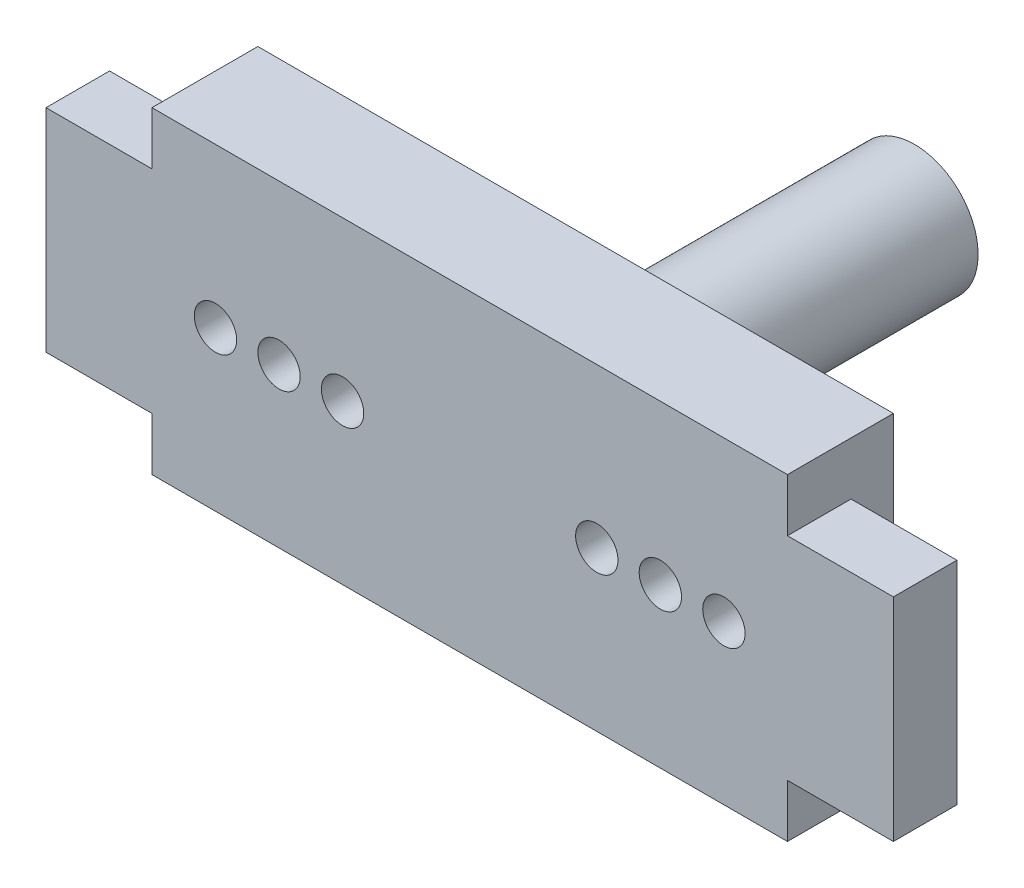
ISO-10303-21;
HEADER;
FILE_DESCRIPTION(('STEP AP214'),'2;1');
FILE_NAME('part.step','',(''),(''),'','','');
FILE_SCHEMA(('AUTOMOTIVE_DESIGN { 1 0 10303 214 1 1 1 1 }'));
ENDSEC;
DATA;
#1=APPLICATION_CONTEXT('core data for automotive mechanical design processes');
#2=APPLICATION_PROTOCOL_DEFINITION('international standard','automotive_design',2000,#1);
#3=PRODUCT_CONTEXT('',#1,'mechanical');
#4=PRODUCT('Part','Part','',(#3));
#5=PRODUCT_RELATED_PRODUCT_CATEGORY('part','',(#4));
#6=PRODUCT_DEFINITION_FORMATION('','',#4);
#7=PRODUCT_DEFINITION_CONTEXT('part definition',#1,'design');
#8=PRODUCT_DEFINITION('design','',#6,#7);
#9=PRODUCT_DEFINITION_SHAPE('','',#8);
#10=(LENGTH_UNIT() NAMED_UNIT(*) SI_UNIT(.MILLI.,.METRE.));
#11=(NAMED_UNIT(*) PLANE_ANGLE_UNIT() SI_UNIT($,.RADIAN.));
#12=(NAMED_UNIT(*) SI_UNIT($,.STERADIAN.) SOLID_ANGLE_UNIT());
#13=UNCERTAINTY_MEASURE_WITH_UNIT(LENGTH_MEASURE(1.E-05),#10,'distance_accuracy_value','');
#14=(GEOMETRIC_REPRESENTATION_CONTEXT(3) GLOBAL_UNCERTAINTY_ASSIGNED_CONTEXT((#13)) GLOBAL_UNIT_ASSIGNED_CONTEXT((#10,
#11,#12)) REPRESENTATION_CONTEXT('',''));
#15=CARTESIAN_POINT('',(0.,0.,0.));
#16=DIRECTION('',(0.,0.,1.));
#17=DIRECTION('',(1.,0.,0.));
#18=AXIS2_PLACEMENT_3D('',#15,#16,#17);
#19=CARTESIAN_POINT('',(-26.8805369127517,15.,0.));
#20=DIRECTION('',(1.,0.,0.));
#21=DIRECTION('',(0.,0.,-1.));
#22=AXIS2_PLACEMENT_3D('',#19,#20,#21);
#23=PLANE('',#22);
#24=DIRECTION('',(0.,0.,1.));
#25=VECTOR('',#24,1.);
#26=CARTESIAN_POINT('',(-26.8805369127517,12.5,-26.7902684563758));
#27=LINE('',#26,#25);
#28=CARTESIAN_POINT('',(-26.8805369127517,12.5,-26.7902684563758));
#29=VERTEX_POINT('',#28);
#30=CARTESIAN_POINT('',(-26.8805369127517,12.5,-23.7902684563758));
#31=VERTEX_POINT('',#30);
#32=EDGE_CURVE('E128',#29,#31,#27,.T.);
#33=ORIENTED_EDGE('',*,*,#32,.F.);
#34=DIRECTION('',(0.,-1.,0.));
#35=VECTOR('',#34,1.);
#36=CARTESIAN_POINT('',(-26.8805369127517,12.5,-26.7902684563758));
#37=LINE('',#36,#35);
#38=CARTESIAN_POINT('',(-26.8805369127517,2.5,-26.7902684563758));
#39=VERTEX_POINT('',#38);
#40=EDGE_CURVE('E154',#29,#39,#37,.T.);
#41=ORIENTED_EDGE('',*,*,#40,.T.);
#42=DIRECTION('',(0.,0.,1.));
#43=VECTOR('',#42,1.);
#44=CARTESIAN_POINT('',(-26.8805369127517,2.5,-26.7902684563758));
#45=LINE('',#44,#43);
#46=CARTESIAN_POINT('',(-26.8805369127517,2.5,-23.7902684563758));
#47=VERTEX_POINT('',#46);
#48=EDGE_CURVE('E307',#39,#47,#45,.T.);
#49=ORIENTED_EDGE('',*,*,#48,.T.);
#50=DIRECTION('',(0.,-1.,0.));
#51=VECTOR('',#50,1.);
#52=CARTESIAN_POINT('',(-26.8805369127517,15.,-23.7902684563758));
#53=LINE('',#52,#51);
#54=CARTESIAN_POINT('',(-26.8805369127517,0.,-23.7902684563758));
#55=VERTEX_POINT('',#54);
#56=EDGE_CURVE('E160',#47,#55,#53,.T.);
#57=ORIENTED_EDGE('',*,*,#56,.T.);
#58=DIRECTION('',(0.,0.,1.));
#59=VECTOR('',#58,1.);
#60=CARTESIAN_POINT('',(-26.8805369127517,0.,0.));
#61=LINE('',#60,#59);
#62=CARTESIAN_POINT('',(-26.8805369127517,0.,-28.7902684563758));
#63=VERTEX_POINT('',#62);
#64=EDGE_CURVE('E194',#63,#55,#61,.T.);
#65=ORIENTED_EDGE('',*,*,#64,.F.);
#66=DIRECTION('',(0.,-1.,0.));
#67=VECTOR('',#66,1.);
#68=CARTESIAN_POINT('',(-26.8805369127517,15.,-28.7902684563758));
#69=LINE('',#68,#67);
#70=CARTESIAN_POINT('',(-26.8805369127517,15.,-28.7902684563758));
#71=VERTEX_POINT('',#70);
#72=EDGE_CURVE('E11',#71,#63,#69,.T.);
#73=ORIENTED_EDGE('',*,*,#72,.F.);
#74=DIRECTION('',(0.,0.,1.));
#75=VECTOR('',#74,1.);
#76=CARTESIAN_POINT('',(-26.8805369127517,15.,0.));
#77=LINE('',#76,#75);
#78=CARTESIAN_POINT('',(-26.8805369127517,15.,-23.7902684563758));
#79=VERTEX_POINT('',#78);
#80=EDGE_CURVE('E157',#71,#79,#77,.T.);
#81=ORIENTED_EDGE('',*,*,#80,.T.);
#82=EDGE_CURVE('E149',#79,#31,#53,.T.);
#83=ORIENTED_EDGE('',*,*,#82,.T.);
#84=EDGE_LOOP('',(#33,#41,#49,#57,#65,#73,#81,#83));
#85=FACE_BOUND('',#84,.T.);
#86=ADVANCED_FACE('F41',(#85),#23,.T.);
#87=CARTESIAN_POINT('',(0.,15.,-28.7902684563758));
#88=DIRECTION('',(0.,0.,-1.));
#89=DIRECTION('',(-1.,0.,0.));
#90=AXIS2_PLACEMENT_3D('',#87,#88,#89);
#91=PLANE('',#90);
#92=CARTESIAN_POINT('',(-41.8805369127517,7.5,-28.7902684563758));
#93=DIRECTION('',(0.,0.,-1.));
#94=DIRECTION('',(-1.,0.,0.));
#95=AXIS2_PLACEMENT_3D('',#92,#93,#94);
#96=CIRCLE('',#95,3.);
#97=CARTESIAN_POINT('',(-44.8805369127517,7.5,-28.7902684563758));
#98=VERTEX_POINT('',#97);
#99=EDGE_CURVE('E319',#98,#98,#96,.T.);
#100=ORIENTED_EDGE('',*,*,#99,.F.);
#101=EDGE_LOOP('',(#100));
#102=FACE_BOUND('',#101,.T.);
#103=CARTESIAN_POINT('',(-32.8805369127517,7.5,-28.7902684563758));
#104=DIRECTION('',(0.,0.,-1.));
#105=DIRECTION('',(-1.,0.,0.));
#106=AXIS2_PLACEMENT_3D('',#103,#104,#105);
#107=CIRCLE('',#106,0.999999999999998);
#108=CARTESIAN_POINT('',(-33.8805369127517,7.5,-28.7902684563758));
#109=VERTEX_POINT('',#108);
#110=EDGE_CURVE('E243',#109,#109,#107,.T.);
#111=ORIENTED_EDGE('',*,*,#110,.F.);
#112=EDGE_LOOP('',(#111));
#113=FACE_BOUND('',#112,.T.);
#114=CARTESIAN_POINT('',(-29.8805369127517,7.5,-28.7902684563758));
#115=DIRECTION('',(0.,0.,-1.));
#116=DIRECTION('',(-1.,0.,0.));
#117=AXIS2_PLACEMENT_3D('',#114,#115,#116);
#118=CIRCLE('',#117,1.);
#119=CARTESIAN_POINT('',(-30.8805369127517,7.5,-28.7902684563758));
#120=VERTEX_POINT('',#119);
#121=EDGE_CURVE('E235',#120,#120,#118,.T.);
#122=ORIENTED_EDGE('',*,*,#121,.F.);
#123=EDGE_LOOP('',(#122));
#124=FACE_BOUND('',#123,.T.);
#125=CARTESIAN_POINT('',(-53.8805369127517,7.5,-28.7902684563758));
#126=DIRECTION('',(0.,0.,-1.));
#127=DIRECTION('',(1.,0.,0.));
#128=AXIS2_PLACEMENT_3D('',#125,#126,#127);
#129=CIRCLE('',#128,0.999999999999998);
#130=CARTESIAN_POINT('',(-52.8805369127517,7.5,-28.7902684563758));
#131=VERTEX_POINT('',#130);
#132=EDGE_CURVE('E225',#131,#131,#129,.T.);
#133=ORIENTED_EDGE('',*,*,#132,.F.);
#134=EDGE_LOOP('',(#133));
#135=FACE_BOUND('',#134,.T.);
#136=CARTESIAN_POINT('',(-50.8805369127517,7.5,-28.7902684563758));
#137=DIRECTION('',(0.,0.,-1.));
#138=DIRECTION('',(1.,0.,0.));
#139=AXIS2_PLACEMENT_3D('',#136,#137,#138);
#140=CIRCLE('',#139,0.999999999999998);
#141=CARTESIAN_POINT('',(-49.8805369127517,7.5,-28.7902684563758));
#142=VERTEX_POINT('',#141);
#143=EDGE_CURVE('E226',#142,#142,#140,.T.);
#144=ORIENTED_EDGE('',*,*,#143,.F.);
#145=EDGE_LOOP('',(#144));
#146=FACE_BOUND('',#145,.T.);
#147=CARTESIAN_POINT('',(-47.8805369127517,7.5,-28.7902684563758));
#148=DIRECTION('',(0.,0.,-1.));
#149=DIRECTION('',(1.,0.,0.));
#150=AXIS2_PLACEMENT_3D('',#147,#148,#149);
#151=CIRCLE('',#150,0.999999999999998);
#152=CARTESIAN_POINT('',(-46.8805369127517,7.5,-28.7902684563758));
#153=VERTEX_POINT('',#152);
#154=EDGE_CURVE('E256',#153,#153,#151,.T.);
#155=ORIENTED_EDGE('',*,*,#154,.F.);
#156=EDGE_LOOP('',(#155));
#157=FACE_BOUND('',#156,.T.);
#158=CARTESIAN_POINT('',(-35.8805369127517,7.5,-28.7902684563758));
#159=DIRECTION('',(0.,0.,-1.));
#160=DIRECTION('',(-1.,0.,0.));
#161=AXIS2_PLACEMENT_3D('',#158,#159,#160);
#162=CIRCLE('',#161,0.999999999999998);
#163=CARTESIAN_POINT('',(-36.8805369127517,7.5,-28.7902684563758));
#164=VERTEX_POINT('',#163);
#165=EDGE_CURVE('E216',#164,#164,#162,.T.);
#166=ORIENTED_EDGE('',*,*,#165,.F.);
#167=EDGE_LOOP('',(#166));
#168=FACE_BOUND('',#167,.T.);
#169=DIRECTION('',(1.,0.,0.));
#170=VECTOR('',#169,1.);
#171=CARTESIAN_POINT('',(0.,0.,-28.7902684563758));
#172=LINE('',#171,#170);
#173=CARTESIAN_POINT('',(-56.8805369127517,0.,-28.7902684563758));
#174=VERTEX_POINT('',#173);
#175=EDGE_CURVE('E188',#174,#63,#172,.T.);
#176=ORIENTED_EDGE('',*,*,#175,.F.);
#177=DIRECTION('',(0.,-1.,0.));
#178=VECTOR('',#177,1.);
#179=CARTESIAN_POINT('',(-56.8805369127517,15.,-28.7902684563758));
#180=LINE('',#179,#178);
#181=CARTESIAN_POINT('',(-56.8805369127517,15.,-28.7902684563758));
#182=VERTEX_POINT('',#181);
#183=EDGE_CURVE('E49',#182,#174,#180,.T.);
#184=ORIENTED_EDGE('',*,*,#183,.F.);
#185=DIRECTION('',(1.,0.,0.));
#186=VECTOR('',#185,1.);
#187=CARTESIAN_POINT('',(0.,15.,-28.7902684563758));
#188=LINE('',#187,#186);
#189=EDGE_CURVE('E208',#182,#71,#188,.T.);
#190=ORIENTED_EDGE('',*,*,#189,.T.);
#191=ORIENTED_EDGE('',*,*,#72,.T.);
#192=EDGE_LOOP('',(#176,#184,#190,#191));
#193=FACE_BOUND('',#192,.T.);
#194=ADVANCED_FACE('F189',(#102,#113,#124,#135,#146,#157,#168,#193),#91,.T.);
#195=CARTESIAN_POINT('',(-56.8805369127517,15.,0.));
#196=DIRECTION('',(-1.,0.,0.));
#197=DIRECTION('',(0.,0.,1.));
#198=AXIS2_PLACEMENT_3D('',#195,#196,#197);
#199=PLANE('',#198);
#200=DIRECTION('',(0.,0.,1.));
#201=VECTOR('',#200,1.);
#202=CARTESIAN_POINT('',(-56.8805369127517,2.5,-26.7902684563758));
#203=LINE('',#202,#201);
#204=CARTESIAN_POINT('',(-56.8805369127517,2.5,-26.7902684563758));
#205=VERTEX_POINT('',#204);
#206=CARTESIAN_POINT('',(-56.8805369127517,2.5,-23.7902684563758));
#207=VERTEX_POINT('',#206);
#208=EDGE_CURVE('E269',#205,#207,#203,.T.);
#209=ORIENTED_EDGE('',*,*,#208,.F.);
#210=DIRECTION('',(0.,-1.,0.));
#211=VECTOR('',#210,1.);
#212=CARTESIAN_POINT('',(-56.8805369127517,12.5,-26.7902684563758));
#213=LINE('',#212,#211);
#214=CARTESIAN_POINT('',(-56.8805369127517,12.5,-26.7902684563758));
#215=VERTEX_POINT('',#214);
#216=EDGE_CURVE('E272',#215,#205,#213,.T.);
#217=ORIENTED_EDGE('',*,*,#216,.F.);
#218=DIRECTION('',(0.,0.,1.));
#219=VECTOR('',#218,1.);
#220=CARTESIAN_POINT('',(-56.8805369127517,12.5,-26.7902684563758));
#221=LINE('',#220,#219);
#222=CARTESIAN_POINT('',(-56.8805369127517,12.5,-23.7902684563758));
#223=VERTEX_POINT('',#222);
#224=EDGE_CURVE('E266',#215,#223,#221,.T.);
#225=ORIENTED_EDGE('',*,*,#224,.T.);
#226=DIRECTION('',(0.,-1.,0.));
#227=VECTOR('',#226,1.);
#228=CARTESIAN_POINT('',(-56.8805369127517,15.,-23.7902684563758));
#229=LINE('',#228,#227);
#230=CARTESIAN_POINT('',(-56.8805369127517,15.,-23.7902684563758));
#231=VERTEX_POINT('',#230);
#232=EDGE_CURVE('E164',#231,#223,#229,.T.);
#233=ORIENTED_EDGE('',*,*,#232,.F.);
#234=DIRECTION('',(0.,0.,-1.));
#235=VECTOR('',#234,1.);
#236=CARTESIAN_POINT('',(-56.8805369127517,15.,0.));
#237=LINE('',#236,#235);
#238=EDGE_CURVE('E183',#231,#182,#237,.T.);
#239=ORIENTED_EDGE('',*,*,#238,.T.);
#240=ORIENTED_EDGE('',*,*,#183,.T.);
#241=DIRECTION('',(0.,0.,-1.));
#242=VECTOR('',#241,1.);
#243=CARTESIAN_POINT('',(-56.8805369127517,0.,0.));
#244=LINE('',#243,#242);
#245=CARTESIAN_POINT('',(-56.8805369127517,0.,-23.7902684563758));
#246=VERTEX_POINT('',#245);
#247=EDGE_CURVE('E181',#246,#174,#244,.T.);
#248=ORIENTED_EDGE('',*,*,#247,.F.);
#249=EDGE_CURVE('E159',#207,#246,#229,.T.);
#250=ORIENTED_EDGE('',*,*,#249,.F.);
#251=EDGE_LOOP('',(#209,#217,#225,#233,#239,#240,#248,#250));
#252=FACE_BOUND('',#251,.T.);
#253=ADVANCED_FACE('F178',(#252),#199,.T.);
#254=CARTESIAN_POINT('',(0.,15.,-23.7902684563758));
#255=DIRECTION('',(0.,0.,-1.));
#256=DIRECTION('',(-1.,0.,0.));
#257=AXIS2_PLACEMENT_3D('',#254,#255,#256);
#258=PLANE('',#257);
#259=CARTESIAN_POINT('',(-32.8805369127517,7.5,-23.7902684563758));
#260=DIRECTION('',(0.,0.,-1.));
#261=DIRECTION('',(-1.,0.,0.));
#262=AXIS2_PLACEMENT_3D('',#259,#260,#261);
#263=CIRCLE('',#262,0.999999999999998);
#264=CARTESIAN_POINT('',(-33.8805369127517,7.5,-23.7902684563758));
#265=VERTEX_POINT('',#264);
#266=EDGE_CURVE('E220',#265,#265,#263,.F.);
#267=ORIENTED_EDGE('',*,*,#266,.F.);
#268=EDGE_LOOP('',(#267));
#269=FACE_BOUND('',#268,.T.);
#270=CARTESIAN_POINT('',(-29.8805369127517,7.5,-23.7902684563758));
#271=DIRECTION('',(0.,0.,-1.));
#272=DIRECTION('',(-1.,0.,0.));
#273=AXIS2_PLACEMENT_3D('',#270,#271,#272);
#274=CIRCLE('',#273,1.);
#275=CARTESIAN_POINT('',(-30.8805369127517,7.5,-23.7902684563758));
#276=VERTEX_POINT('',#275);
#277=EDGE_CURVE('E239',#276,#276,#274,.F.);
#278=ORIENTED_EDGE('',*,*,#277,.F.);
#279=EDGE_LOOP('',(#278));
#280=FACE_BOUND('',#279,.T.);
#281=CARTESIAN_POINT('',(-53.8805369127517,7.5,-23.7902684563758));
#282=DIRECTION('',(0.,0.,-1.));
#283=DIRECTION('',(-1.,0.,0.));
#284=AXIS2_PLACEMENT_3D('',#281,#282,#283);
#285=CIRCLE('',#284,0.999999999999998);
#286=CARTESIAN_POINT('',(-54.8805369127517,7.5,-23.7902684563758));
#287=VERTEX_POINT('',#286);
#288=EDGE_CURVE('E231',#287,#287,#285,.F.);
#289=ORIENTED_EDGE('',*,*,#288,.F.);
#290=EDGE_LOOP('',(#289));
#291=FACE_BOUND('',#290,.T.);
#292=CARTESIAN_POINT('',(-50.8805369127517,7.5,-23.7902684563758));
#293=DIRECTION('',(0.,0.,-1.));
#294=DIRECTION('',(-1.,0.,0.));
#295=AXIS2_PLACEMENT_3D('',#292,#293,#294);
#296=CIRCLE('',#295,0.999999999999998);
#297=CARTESIAN_POINT('',(-51.8805369127517,7.5,-23.7902684563758));
#298=VERTEX_POINT('',#297);
#299=EDGE_CURVE('E221',#298,#298,#296,.F.);
#300=ORIENTED_EDGE('',*,*,#299,.F.);
#301=EDGE_LOOP('',(#300));
#302=FACE_BOUND('',#301,.T.);
#303=CARTESIAN_POINT('',(-47.8805369127517,7.5,-23.7902684563758));
#304=DIRECTION('',(0.,0.,-1.));
#305=DIRECTION('',(-1.,0.,0.));
#306=AXIS2_PLACEMENT_3D('',#303,#304,#305);
#307=CIRCLE('',#306,0.999999999999998);
#308=CARTESIAN_POINT('',(-48.8805369127517,7.5,-23.7902684563758));
#309=VERTEX_POINT('',#308);
#310=EDGE_CURVE('E230',#309,#309,#307,.F.);
#311=ORIENTED_EDGE('',*,*,#310,.F.);
#312=EDGE_LOOP('',(#311));
#313=FACE_BOUND('',#312,.T.);
#314=CARTESIAN_POINT('',(-35.8805369127517,7.5,-23.7902684563758));
#315=DIRECTION('',(0.,0.,-1.));
#316=DIRECTION('',(-1.,0.,0.));
#317=AXIS2_PLACEMENT_3D('',#314,#315,#316);
#318=CIRCLE('',#317,0.999999999999998);
#319=CARTESIAN_POINT('',(-36.8805369127517,7.5,-23.7902684563758));
#320=VERTEX_POINT('',#319);
#321=EDGE_CURVE('E203',#320,#320,#318,.F.);
#322=ORIENTED_EDGE('',*,*,#321,.F.);
#323=EDGE_LOOP('',(#322));
#324=FACE_BOUND('',#323,.T.);
#325=DIRECTION('',(1.,0.,0.));
#326=VECTOR('',#325,1.);
#327=CARTESIAN_POINT('',(0.,0.,-23.7902684563758));
#328=LINE('',#327,#326);
#329=EDGE_CURVE('E168',#246,#55,#328,.T.);
#330=ORIENTED_EDGE('',*,*,#329,.T.);
#331=ORIENTED_EDGE('',*,*,#56,.F.);
#332=DIRECTION('',(1.,0.,0.));
#333=VECTOR('',#332,1.);
#334=CARTESIAN_POINT('',(-26.8805369127517,2.5,-23.7902684563758));
#335=LINE('',#334,#333);
#336=CARTESIAN_POINT('',(-21.8805369127517,2.50000000000001,-23.7902684563758));
#337=VERTEX_POINT('',#336);
#338=EDGE_CURVE('E56',#47,#337,#335,.T.);
#339=ORIENTED_EDGE('',*,*,#338,.T.);
#340=DIRECTION('',(0.,-1.,0.));
#341=VECTOR('',#340,1.);
#342=CARTESIAN_POINT('',(-21.8805369127517,12.5,-23.7902684563758));
#343=LINE('',#342,#341);
#344=CARTESIAN_POINT('',(-21.8805369127517,12.5,-23.7902684563758));
#345=VERTEX_POINT('',#344);
#346=EDGE_CURVE('E152',#345,#337,#343,.T.);
#347=ORIENTED_EDGE('',*,*,#346,.F.);
#348=DIRECTION('',(1.,0.,0.));
#349=VECTOR('',#348,1.);
#350=CARTESIAN_POINT('',(-26.8805369127517,12.5,-23.7902684563758));
#351=LINE('',#350,#349);
#352=EDGE_CURVE('E132',#31,#345,#351,.T.);
#353=ORIENTED_EDGE('',*,*,#352,.F.);
#354=ORIENTED_EDGE('',*,*,#82,.F.);
#355=DIRECTION('',(1.,0.,0.));
#356=VECTOR('',#355,1.);
#357=CARTESIAN_POINT('',(0.,15.,-23.7902684563758));
#358=LINE('',#357,#356);
#359=EDGE_CURVE('E166',#231,#79,#358,.T.);
#360=ORIENTED_EDGE('',*,*,#359,.F.);
#361=ORIENTED_EDGE('',*,*,#232,.T.);
#362=DIRECTION('',(-1.,0.,0.));
#363=VECTOR('',#362,1.);
#364=CARTESIAN_POINT('',(-56.8805369127517,12.5,-23.7902684563758));
#365=LINE('',#364,#363);
#366=CARTESIAN_POINT('',(-61.8805369127517,12.5,-23.7902684563758));
#367=VERTEX_POINT('',#366);
#368=EDGE_CURVE('E64',#223,#367,#365,.T.);
#369=ORIENTED_EDGE('',*,*,#368,.T.);
#370=DIRECTION('',(0.,-1.,0.));
#371=VECTOR('',#370,1.);
#372=CARTESIAN_POINT('',(-61.8805369127517,12.5,-23.7902684563758));
#373=LINE('',#372,#371);
#374=CARTESIAN_POINT('',(-61.8805369127517,2.5,-23.7902684563758));
#375=VERTEX_POINT('',#374);
#376=EDGE_CURVE('E276',#367,#375,#373,.T.);
#377=ORIENTED_EDGE('',*,*,#376,.T.);
#378=DIRECTION('',(-1.,0.,0.));
#379=VECTOR('',#378,1.);
#380=CARTESIAN_POINT('',(-56.8805369127517,2.5,-23.7902684563758));
#381=LINE('',#380,#379);
#382=EDGE_CURVE('E280',#207,#375,#381,.T.);
#383=ORIENTED_EDGE('',*,*,#382,.F.);
#384=ORIENTED_EDGE('',*,*,#249,.T.);
#385=EDGE_LOOP('',(#330,#331,#339,#347,#353,#354,#360,#361,#369,#377,#383,#384));
#386=FACE_BOUND('',#385,.T.);
#387=ADVANCED_FACE('F147',(#269,#280,#291,#302,#313,#324,#386),#258,.F.);
#388=CARTESIAN_POINT('',(0.,15.,0.));
#389=DIRECTION('',(0.,1.,0.));
#390=DIRECTION('',(0.,0.,1.));
#391=AXIS2_PLACEMENT_3D('',#388,#389,#390);
#392=PLANE('',#391);
#393=ORIENTED_EDGE('',*,*,#80,.F.);
#394=ORIENTED_EDGE('',*,*,#189,.F.);
#395=ORIENTED_EDGE('',*,*,#238,.F.);
#396=ORIENTED_EDGE('',*,*,#359,.T.);
#397=EDGE_LOOP('',(#393,#394,#395,#396));
#398=FACE_BOUND('',#397,.T.);
#399=ADVANCED_FACE('F362',(#398),#392,.T.);
#400=CARTESIAN_POINT('',(0.,0.,0.));
#401=DIRECTION('',(0.,1.,0.));
#402=DIRECTION('',(0.,0.,1.));
#403=AXIS2_PLACEMENT_3D('',#400,#401,#402);
#404=PLANE('',#403);
#405=ORIENTED_EDGE('',*,*,#64,.T.);
#406=ORIENTED_EDGE('',*,*,#329,.F.);
#407=ORIENTED_EDGE('',*,*,#247,.T.);
#408=ORIENTED_EDGE('',*,*,#175,.T.);
#409=EDGE_LOOP('',(#405,#406,#407,#408));
#410=FACE_BOUND('',#409,.T.);
#411=ADVANCED_FACE('F197',(#410),#404,.F.);
#412=CARTESIAN_POINT('',(-35.8805369127517,7.5,-20.9618413316296));
#413=DIRECTION('',(0.,0.,-1.));
#414=DIRECTION('',(-1.,0.,0.));
#415=AXIS2_PLACEMENT_3D('',#412,#413,#414);
#416=CYLINDRICAL_SURFACE('',#415,0.999999999999998);
#417=ORIENTED_EDGE('',*,*,#321,.T.);
#418=EDGE_LOOP('',(#417));
#419=FACE_BOUND('',#418,.T.);
#420=ORIENTED_EDGE('',*,*,#165,.T.);
#421=EDGE_LOOP('',(#420));
#422=FACE_BOUND('',#421,.T.);
#423=ADVANCED_FACE('F350',(#419,#422),#416,.F.);
#424=CARTESIAN_POINT('',(-47.8805369127517,7.5,-20.9618413316296));
#425=DIRECTION('',(0.,0.,-1.));
#426=DIRECTION('',(-1.,0.,0.));
#427=AXIS2_PLACEMENT_3D('',#424,#425,#426);
#428=CYLINDRICAL_SURFACE('',#427,0.999999999999998);
#429=ORIENTED_EDGE('',*,*,#310,.T.);
#430=EDGE_LOOP('',(#429));
#431=FACE_BOUND('',#430,.T.);
#432=ORIENTED_EDGE('',*,*,#154,.T.);
#433=EDGE_LOOP('',(#432));
#434=FACE_BOUND('',#433,.T.);
#435=ADVANCED_FACE('F352',(#431,#434),#428,.F.);
#436=CARTESIAN_POINT('',(-50.8805369127517,7.5,-20.9618413316296));
#437=DIRECTION('',(0.,0.,-1.));
#438=DIRECTION('',(-1.,0.,0.));
#439=AXIS2_PLACEMENT_3D('',#436,#437,#438);
#440=CYLINDRICAL_SURFACE('',#439,0.999999999999998);
#441=ORIENTED_EDGE('',*,*,#299,.T.);
#442=EDGE_LOOP('',(#441));
#443=FACE_BOUND('',#442,.T.);
#444=ORIENTED_EDGE('',*,*,#143,.T.);
#445=EDGE_LOOP('',(#444));
#446=FACE_BOUND('',#445,.T.);
#447=ADVANCED_FACE('F359',(#443,#446),#440,.F.);
#448=CARTESIAN_POINT('',(-53.8805369127517,7.5,-20.9618413316296));
#449=DIRECTION('',(0.,0.,-1.));
#450=DIRECTION('',(-1.,0.,0.));
#451=AXIS2_PLACEMENT_3D('',#448,#449,#450);
#452=CYLINDRICAL_SURFACE('',#451,0.999999999999998);
#453=ORIENTED_EDGE('',*,*,#288,.T.);
#454=EDGE_LOOP('',(#453));
#455=FACE_BOUND('',#454,.T.);
#456=ORIENTED_EDGE('',*,*,#132,.T.);
#457=EDGE_LOOP('',(#456));
#458=FACE_BOUND('',#457,.T.);
#459=ADVANCED_FACE('F419',(#455,#458),#452,.F.);
#460=CARTESIAN_POINT('',(-29.8805369127517,7.5,-20.9618413316296));
#461=DIRECTION('',(0.,0.,-1.));
#462=DIRECTION('',(-1.,0.,0.));
#463=AXIS2_PLACEMENT_3D('',#460,#461,#462);
#464=CYLINDRICAL_SURFACE('',#463,1.);
#465=ORIENTED_EDGE('',*,*,#277,.T.);
#466=EDGE_LOOP('',(#465));
#467=FACE_BOUND('',#466,.T.);
#468=ORIENTED_EDGE('',*,*,#121,.T.);
#469=EDGE_LOOP('',(#468));
#470=FACE_BOUND('',#469,.T.);
#471=ADVANCED_FACE('F428',(#467,#470),#464,.F.);
#472=CARTESIAN_POINT('',(-32.8805369127517,7.5,-20.9618413316296));
#473=DIRECTION('',(0.,0.,-1.));
#474=DIRECTION('',(-1.,0.,0.));
#475=AXIS2_PLACEMENT_3D('',#472,#473,#474);
#476=CYLINDRICAL_SURFACE('',#475,0.999999999999998);
#477=ORIENTED_EDGE('',*,*,#266,.T.);
#478=EDGE_LOOP('',(#477));
#479=FACE_BOUND('',#478,.T.);
#480=ORIENTED_EDGE('',*,*,#110,.T.);
#481=EDGE_LOOP('',(#480));
#482=FACE_BOUND('',#481,.T.);
#483=ADVANCED_FACE('F437',(#479,#482),#476,.F.);
#484=CARTESIAN_POINT('',(-56.8805369127517,2.5,-26.7902684563758));
#485=DIRECTION('',(0.,1.,0.));
#486=DIRECTION('',(0.,0.,1.));
#487=AXIS2_PLACEMENT_3D('',#484,#485,#486);
#488=PLANE('',#487);
#489=ORIENTED_EDGE('',*,*,#382,.T.);
#490=DIRECTION('',(0.,0.,1.));
#491=VECTOR('',#490,1.);
#492=CARTESIAN_POINT('',(-61.8805369127517,2.5,-26.7902684563758));
#493=LINE('',#492,#491);
#494=CARTESIAN_POINT('',(-61.8805369127517,2.5,-26.7902684563758));
#495=VERTEX_POINT('',#494);
#496=EDGE_CURVE('E260',#495,#375,#493,.T.);
#497=ORIENTED_EDGE('',*,*,#496,.F.);
#498=DIRECTION('',(-1.,0.,0.));
#499=VECTOR('',#498,1.);
#500=CARTESIAN_POINT('',(-56.8805369127517,2.5,-26.7902684563758));
#501=LINE('',#500,#499);
#502=EDGE_CURVE('E275',#205,#495,#501,.T.);
#503=ORIENTED_EDGE('',*,*,#502,.F.);
#504=ORIENTED_EDGE('',*,*,#208,.T.);
#505=EDGE_LOOP('',(#489,#497,#503,#504));
#506=FACE_BOUND('',#505,.T.);
#507=ADVANCED_FACE('F446',(#506),#488,.F.);
#508=CARTESIAN_POINT('',(-61.8805369127517,12.5,-26.7902684563758));
#509=DIRECTION('',(-1.,0.,0.));
#510=DIRECTION('',(0.,0.,1.));
#511=AXIS2_PLACEMENT_3D('',#508,#509,#510);
#512=PLANE('',#511);
#513=ORIENTED_EDGE('',*,*,#376,.F.);
#514=DIRECTION('',(0.,0.,1.));
#515=VECTOR('',#514,1.);
#516=CARTESIAN_POINT('',(-61.8805369127517,12.5,-26.7902684563758));
#517=LINE('',#516,#515);
#518=CARTESIAN_POINT('',(-61.8805369127517,12.5,-26.7902684563758));
#519=VERTEX_POINT('',#518);
#520=EDGE_CURVE('E263',#519,#367,#517,.T.);
#521=ORIENTED_EDGE('',*,*,#520,.F.);
#522=DIRECTION('',(0.,-1.,0.));
#523=VECTOR('',#522,1.);
#524=CARTESIAN_POINT('',(-61.8805369127517,12.5,-26.7902684563758));
#525=LINE('',#524,#523);
#526=EDGE_CURVE('E290',#519,#495,#525,.T.);
#527=ORIENTED_EDGE('',*,*,#526,.T.);
#528=ORIENTED_EDGE('',*,*,#496,.T.);
#529=EDGE_LOOP('',(#513,#521,#527,#528));
#530=FACE_BOUND('',#529,.T.);
#531=ADVANCED_FACE('F456',(#530),#512,.T.);
#532=CARTESIAN_POINT('',(-56.8805369127517,12.5,-26.7902684563758));
#533=DIRECTION('',(0.,1.,0.));
#534=DIRECTION('',(-1.,0.,0.));
#535=AXIS2_PLACEMENT_3D('',#532,#533,#534);
#536=PLANE('',#535);
#537=ORIENTED_EDGE('',*,*,#368,.F.);
#538=ORIENTED_EDGE('',*,*,#224,.F.);
#539=DIRECTION('',(-1.,0.,0.));
#540=VECTOR('',#539,1.);
#541=CARTESIAN_POINT('',(-56.8805369127517,12.5,-26.7902684563758));
#542=LINE('',#541,#540);
#543=EDGE_CURVE('E286',#215,#519,#542,.T.);
#544=ORIENTED_EDGE('',*,*,#543,.T.);
#545=ORIENTED_EDGE('',*,*,#520,.T.);
#546=EDGE_LOOP('',(#537,#538,#544,#545));
#547=FACE_BOUND('',#546,.T.);
#548=ADVANCED_FACE('F464',(#547),#536,.T.);
#549=CARTESIAN_POINT('',(0.,0.,-26.7902684563758));
#550=DIRECTION('',(0.,0.,1.));
#551=DIRECTION('',(1.,0.,0.));
#552=AXIS2_PLACEMENT_3D('',#549,#550,#551);
#553=PLANE('',#552);
#554=ORIENTED_EDGE('',*,*,#502,.T.);
#555=ORIENTED_EDGE('',*,*,#526,.F.);
#556=ORIENTED_EDGE('',*,*,#543,.F.);
#557=ORIENTED_EDGE('',*,*,#216,.T.);
#558=EDGE_LOOP('',(#554,#555,#556,#557));
#559=FACE_BOUND('',#558,.T.);
#560=ADVANCED_FACE('F472',(#559),#553,.F.);
#561=CARTESIAN_POINT('',(-26.8805369127517,12.5,-26.7902684563758));
#562=DIRECTION('',(0.,-1.,0.));
#563=DIRECTION('',(0.,0.,-1.));
#564=AXIS2_PLACEMENT_3D('',#561,#562,#563);
#565=PLANE('',#564);
#566=ORIENTED_EDGE('',*,*,#352,.T.);
#567=DIRECTION('',(0.,0.,1.));
#568=VECTOR('',#567,1.);
#569=CARTESIAN_POINT('',(-21.8805369127517,12.5,-26.7902684563758));
#570=LINE('',#569,#568);
#571=CARTESIAN_POINT('',(-21.8805369127517,12.5,-26.7902684563758));
#572=VERTEX_POINT('',#571);
#573=EDGE_CURVE('E140',#572,#345,#570,.T.);
#574=ORIENTED_EDGE('',*,*,#573,.F.);
#575=DIRECTION('',(1.,0.,0.));
#576=VECTOR('',#575,1.);
#577=CARTESIAN_POINT('',(-26.8805369127517,12.5,-26.7902684563758));
#578=LINE('',#577,#576);
#579=EDGE_CURVE('E134',#29,#572,#578,.T.);
#580=ORIENTED_EDGE('',*,*,#579,.F.);
#581=ORIENTED_EDGE('',*,*,#32,.T.);
#582=EDGE_LOOP('',(#566,#574,#580,#581));
#583=FACE_BOUND('',#582,.T.);
#584=ADVANCED_FACE('F130',(#583),#565,.F.);
#585=CARTESIAN_POINT('',(-21.8805369127517,12.5,-26.7902684563758));
#586=DIRECTION('',(-1.,0.,0.));
#587=DIRECTION('',(0.,0.,1.));
#588=AXIS2_PLACEMENT_3D('',#585,#586,#587);
#589=PLANE('',#588);
#590=ORIENTED_EDGE('',*,*,#346,.T.);
#591=DIRECTION('',(0.,0.,1.));
#592=VECTOR('',#591,1.);
#593=CARTESIAN_POINT('',(-21.8805369127517,2.50000000000001,-26.7902684563758));
#594=LINE('',#593,#592);
#595=CARTESIAN_POINT('',(-21.8805369127517,2.50000000000001,-26.7902684563758));
#596=VERTEX_POINT('',#595);
#597=EDGE_CURVE('E314',#596,#337,#594,.T.);
#598=ORIENTED_EDGE('',*,*,#597,.F.);
#599=DIRECTION('',(0.,-1.,0.));
#600=VECTOR('',#599,1.);
#601=CARTESIAN_POINT('',(-21.8805369127517,12.5,-26.7902684563758));
#602=LINE('',#601,#600);
#603=EDGE_CURVE('E302',#572,#596,#602,.T.);
#604=ORIENTED_EDGE('',*,*,#603,.F.);
#605=ORIENTED_EDGE('',*,*,#573,.T.);
#606=EDGE_LOOP('',(#590,#598,#604,#605));
#607=FACE_BOUND('',#606,.T.);
#608=ADVANCED_FACE('F486',(#607),#589,.F.);
#609=CARTESIAN_POINT('',(-26.8805369127517,2.5,-26.7902684563758));
#610=DIRECTION('',(0.,-1.,0.));
#611=DIRECTION('',(1.,0.,0.));
#612=AXIS2_PLACEMENT_3D('',#609,#610,#611);
#613=PLANE('',#612);
#614=ORIENTED_EDGE('',*,*,#338,.F.);
#615=ORIENTED_EDGE('',*,*,#48,.F.);
#616=DIRECTION('',(1.,0.,0.));
#617=VECTOR('',#616,1.);
#618=CARTESIAN_POINT('',(-26.8805369127517,2.5,-26.7902684563758));
#619=LINE('',#618,#617);
#620=EDGE_CURVE('E298',#39,#596,#619,.T.);
#621=ORIENTED_EDGE('',*,*,#620,.T.);
#622=ORIENTED_EDGE('',*,*,#597,.T.);
#623=EDGE_LOOP('',(#614,#615,#621,#622));
#624=FACE_BOUND('',#623,.T.);
#625=ADVANCED_FACE('F493',(#624),#613,.T.);
#626=CARTESIAN_POINT('',(0.,0.,-26.7902684563758));
#627=DIRECTION('',(0.,0.,1.));
#628=DIRECTION('',(1.,0.,0.));
#629=AXIS2_PLACEMENT_3D('',#626,#627,#628);
#630=PLANE('',#629);
#631=ORIENTED_EDGE('',*,*,#40,.F.);
#632=ORIENTED_EDGE('',*,*,#579,.T.);
#633=ORIENTED_EDGE('',*,*,#603,.T.);
#634=ORIENTED_EDGE('',*,*,#620,.F.);
#635=EDGE_LOOP('',(#631,#632,#633,#634));
#636=FACE_BOUND('',#635,.T.);
#637=ADVANCED_FACE('F332',(#636),#630,.F.);
#638=CARTESIAN_POINT('',(-41.8805369127517,7.5,-44.7902684563758));
#639=DIRECTION('',(0.,0.,1.));
#640=DIRECTION('',(1.,0.,0.));
#641=AXIS2_PLACEMENT_3D('',#638,#639,#640);
#642=CYLINDRICAL_SURFACE('',#641,3.);
#643=CARTESIAN_POINT('',(-41.8805369127517,7.5,-44.7902684563758));
#644=DIRECTION('',(0.,0.,-1.));
#645=DIRECTION('',(-1.,0.,0.));
#646=AXIS2_PLACEMENT_3D('',#643,#644,#645);
#647=CIRCLE('',#646,3.);
#648=CARTESIAN_POINT('',(-44.8805369127517,7.5,-44.7902684563758));
#649=VERTEX_POINT('',#648);
#650=EDGE_CURVE('E141',#649,#649,#647,.T.);
#651=ORIENTED_EDGE('',*,*,#650,.F.);
#652=EDGE_LOOP('',(#651));
#653=FACE_BOUND('',#652,.T.);
#654=ORIENTED_EDGE('',*,*,#99,.T.);
#655=EDGE_LOOP('',(#654));
#656=FACE_BOUND('',#655,.T.);
#657=ADVANCED_FACE('F329',(#653,#656),#642,.T.);
#658=CARTESIAN_POINT('',(-41.8805369127517,7.5,-44.7902684563758));
#659=DIRECTION('',(0.,0.,-1.));
#660=DIRECTION('',(-1.,0.,0.));
#661=AXIS2_PLACEMENT_3D('',#658,#659,#660);
#662=PLANE('',#661);
#663=ORIENTED_EDGE('',*,*,#650,.T.);
#664=EDGE_LOOP('',(#663));
#665=FACE_BOUND('',#664,.T.);
#666=ADVANCED_FACE('F327',(#665),#662,.T.);
#667=CLOSED_SHELL('',(#86,#194,#253,#387,#399,#411,#423,#435,#447,#459,#471,#483,#507,#531,#548,
#560,#584,#608,#625,#637,#657,#666));
#668=MANIFOLD_SOLID_BREP('B2',#667);
#669=ADVANCED_BREP_SHAPE_REPRESENTATION('',(#18,#668),#14);
#670=SHAPE_DEFINITION_REPRESENTATION(#9,#669);
ENDSEC;
END-ISO-10303-21;
